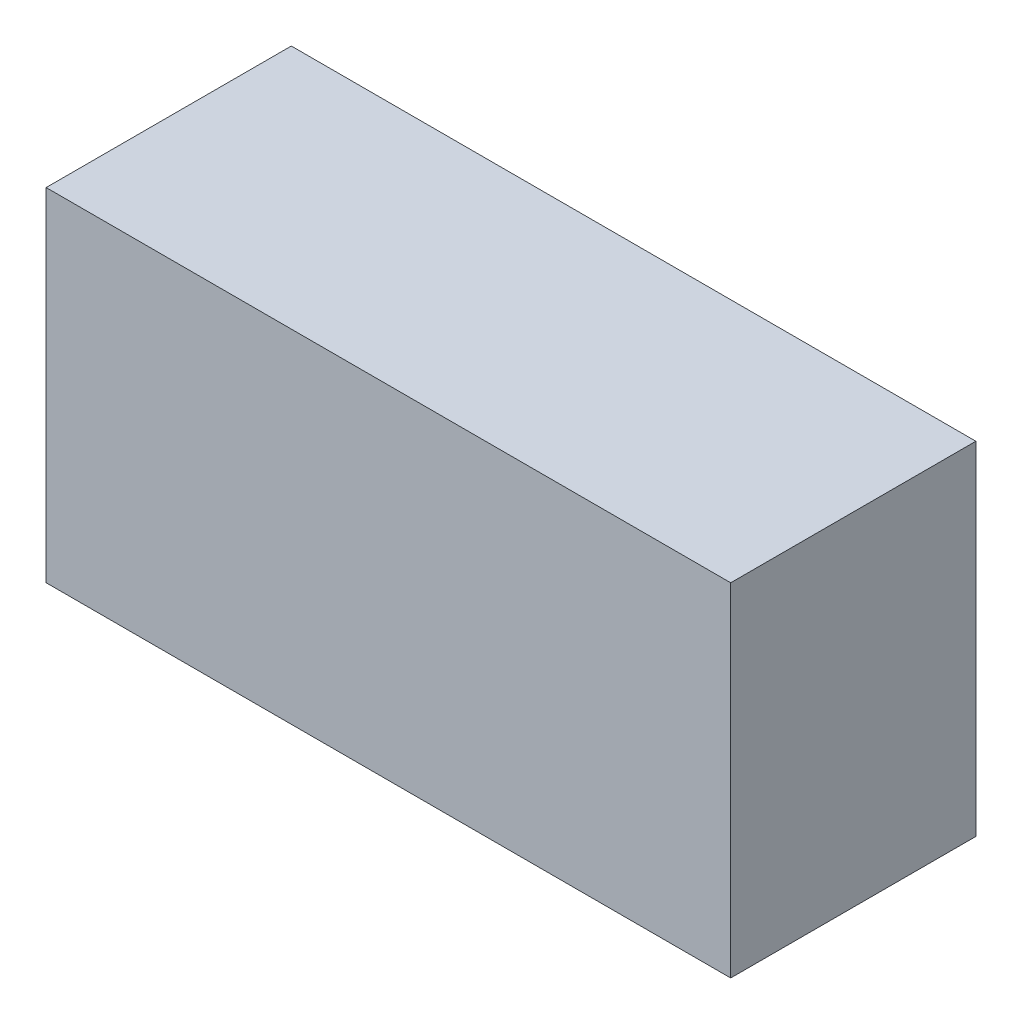
ISO-10303-21;
HEADER;
FILE_DESCRIPTION(('STEP AP214'),'2;1');
FILE_NAME('part.step','',(''),(''),'','','');
FILE_SCHEMA(('AUTOMOTIVE_DESIGN { 1 0 10303 214 1 1 1 1 }'));
ENDSEC;
DATA;
#1=APPLICATION_CONTEXT('core data for automotive mechanical design processes');
#2=APPLICATION_PROTOCOL_DEFINITION('international standard','automotive_design',2000,#1);
#3=PRODUCT_CONTEXT('',#1,'mechanical');
#4=PRODUCT('Part','Part','',(#3));
#5=PRODUCT_RELATED_PRODUCT_CATEGORY('part','',(#4));
#6=PRODUCT_DEFINITION_FORMATION('','',#4);
#7=PRODUCT_DEFINITION_CONTEXT('part definition',#1,'design');
#8=PRODUCT_DEFINITION('design','',#6,#7);
#9=PRODUCT_DEFINITION_SHAPE('','',#8);
#10=(LENGTH_UNIT() NAMED_UNIT(*) SI_UNIT(.MILLI.,.METRE.));
#11=(NAMED_UNIT(*) PLANE_ANGLE_UNIT() SI_UNIT($,.RADIAN.));
#12=(NAMED_UNIT(*) SI_UNIT($,.STERADIAN.) SOLID_ANGLE_UNIT());
#13=UNCERTAINTY_MEASURE_WITH_UNIT(LENGTH_MEASURE(1.E-05),#10,'distance_accuracy_value','');
#14=(GEOMETRIC_REPRESENTATION_CONTEXT(3) GLOBAL_UNCERTAINTY_ASSIGNED_CONTEXT((#13)) GLOBAL_UNIT_ASSIGNED_CONTEXT((#10,
#11,#12)) REPRESENTATION_CONTEXT('',''));
#15=CARTESIAN_POINT('',(0.,0.,0.));
#16=DIRECTION('',(0.,0.,1.));
#17=DIRECTION('',(1.,0.,0.));
#18=AXIS2_PLACEMENT_3D('',#15,#16,#17);
#19=CARTESIAN_POINT('',(0.,0.,1.146));
#20=DIRECTION('',(0.,0.,1.));
#21=DIRECTION('',(1.,0.,0.));
#22=AXIS2_PLACEMENT_3D('',#19,#20,#21);
#23=PLANE('',#22);
#24=DIRECTION('',(-1.,0.,0.));
#25=VECTOR('',#24,1.);
#26=CARTESIAN_POINT('',(1.6,0.8,1.146));
#27=LINE('',#26,#25);
#28=CARTESIAN_POINT('',(-1.6,0.800000000000001,1.146));
#29=VERTEX_POINT('',#28);
#30=CARTESIAN_POINT('',(1.6,0.8,1.146));
#31=VERTEX_POINT('',#30);
#32=EDGE_CURVE('E58',#29,#31,#27,.F.);
#33=ORIENTED_EDGE('',*,*,#32,.F.);
#34=DIRECTION('',(0.,-1.,0.));
#35=VECTOR('',#34,1.);
#36=CARTESIAN_POINT('',(-1.6,0.800000000000001,1.146));
#37=LINE('',#36,#35);
#38=CARTESIAN_POINT('',(-1.6,-0.799999999999999,1.146));
#39=VERTEX_POINT('',#38);
#40=EDGE_CURVE('E53',#39,#29,#37,.F.);
#41=ORIENTED_EDGE('',*,*,#40,.F.);
#42=DIRECTION('',(1.,0.,0.));
#43=VECTOR('',#42,1.);
#44=CARTESIAN_POINT('',(-1.6,-0.8,1.146));
#45=LINE('',#44,#43);
#46=CARTESIAN_POINT('',(1.6,-0.8,1.146));
#47=VERTEX_POINT('',#46);
#48=EDGE_CURVE('E68',#47,#39,#45,.F.);
#49=ORIENTED_EDGE('',*,*,#48,.F.);
#50=DIRECTION('',(0.,1.,0.));
#51=VECTOR('',#50,1.);
#52=CARTESIAN_POINT('',(1.6,-0.800000000000001,1.146));
#53=LINE('',#52,#51);
#54=EDGE_CURVE('E20',#31,#47,#53,.F.);
#55=ORIENTED_EDGE('',*,*,#54,.F.);
#56=EDGE_LOOP('',(#33,#41,#49,#55));
#57=FACE_BOUND('',#56,.T.);
#58=ADVANCED_FACE('F17',(#57),#23,.T.);
#59=CARTESIAN_POINT('',(1.6,-0.800000000000001,0.));
#60=DIRECTION('',(1.,0.,0.));
#61=DIRECTION('',(0.,1.,0.));
#62=AXIS2_PLACEMENT_3D('',#59,#60,#61);
#63=PLANE('',#62);
#64=ORIENTED_EDGE('',*,*,#54,.T.);
#65=DIRECTION('',(0.,0.,1.));
#66=VECTOR('',#65,1.);
#67=CARTESIAN_POINT('',(1.6,-0.800000000000001,0.));
#68=LINE('',#67,#66);
#69=CARTESIAN_POINT('',(1.6,-0.8,0.));
#70=VERTEX_POINT('',#69);
#71=EDGE_CURVE('E79',#70,#47,#68,.T.);
#72=ORIENTED_EDGE('',*,*,#71,.F.);
#73=DIRECTION('',(0.,1.,0.));
#74=VECTOR('',#73,1.);
#75=CARTESIAN_POINT('',(1.6,0.,0.));
#76=LINE('',#75,#74);
#77=CARTESIAN_POINT('',(1.6,0.8,0.));
#78=VERTEX_POINT('',#77);
#79=EDGE_CURVE('E74',#70,#78,#76,.T.);
#80=ORIENTED_EDGE('',*,*,#79,.T.);
#81=DIRECTION('',(0.,0.,1.));
#82=VECTOR('',#81,1.);
#83=CARTESIAN_POINT('',(1.6,0.8,0.));
#84=LINE('',#83,#82);
#85=EDGE_CURVE('E63',#31,#78,#84,.F.);
#86=ORIENTED_EDGE('',*,*,#85,.F.);
#87=EDGE_LOOP('',(#64,#72,#80,#86));
#88=FACE_BOUND('',#87,.T.);
#89=ADVANCED_FACE('F73',(#88),#63,.T.);
#90=CARTESIAN_POINT('',(1.6,0.8,0.));
#91=DIRECTION('',(0.,1.,0.));
#92=DIRECTION('',(-1.,0.,0.));
#93=AXIS2_PLACEMENT_3D('',#90,#91,#92);
#94=PLANE('',#93);
#95=ORIENTED_EDGE('',*,*,#32,.T.);
#96=ORIENTED_EDGE('',*,*,#85,.T.);
#97=DIRECTION('',(1.,0.,0.));
#98=VECTOR('',#97,1.);
#99=CARTESIAN_POINT('',(0.,0.8,0.));
#100=LINE('',#99,#98);
#101=CARTESIAN_POINT('',(-1.6,0.800000000000001,0.));
#102=VERTEX_POINT('',#101);
#103=EDGE_CURVE('E84',#78,#102,#100,.F.);
#104=ORIENTED_EDGE('',*,*,#103,.T.);
#105=DIRECTION('',(0.,0.,1.));
#106=VECTOR('',#105,1.);
#107=CARTESIAN_POINT('',(-1.6,0.800000000000001,0.));
#108=LINE('',#107,#106);
#109=EDGE_CURVE('E65',#29,#102,#108,.F.);
#110=ORIENTED_EDGE('',*,*,#109,.F.);
#111=EDGE_LOOP('',(#95,#96,#104,#110));
#112=FACE_BOUND('',#111,.T.);
#113=ADVANCED_FACE('F60',(#112),#94,.T.);
#114=CARTESIAN_POINT('',(-1.6,0.800000000000001,0.));
#115=DIRECTION('',(-1.,0.,0.));
#116=DIRECTION('',(0.,-1.,0.));
#117=AXIS2_PLACEMENT_3D('',#114,#115,#116);
#118=PLANE('',#117);
#119=ORIENTED_EDGE('',*,*,#40,.T.);
#120=ORIENTED_EDGE('',*,*,#109,.T.);
#121=DIRECTION('',(0.,1.,0.));
#122=VECTOR('',#121,1.);
#123=CARTESIAN_POINT('',(-1.6,0.,0.));
#124=LINE('',#123,#122);
#125=CARTESIAN_POINT('',(-1.6,-0.8,0.));
#126=VERTEX_POINT('',#125);
#127=EDGE_CURVE('E26',#102,#126,#124,.F.);
#128=ORIENTED_EDGE('',*,*,#127,.T.);
#129=DIRECTION('',(0.,0.,1.));
#130=VECTOR('',#129,1.);
#131=CARTESIAN_POINT('',(-1.6,-0.8,0.));
#132=LINE('',#131,#130);
#133=EDGE_CURVE('E34',#39,#126,#132,.F.);
#134=ORIENTED_EDGE('',*,*,#133,.F.);
#135=EDGE_LOOP('',(#119,#120,#128,#134));
#136=FACE_BOUND('',#135,.T.);
#137=ADVANCED_FACE('F88',(#136),#118,.T.);
#138=CARTESIAN_POINT('',(-1.6,-0.8,0.));
#139=DIRECTION('',(0.,-1.,0.));
#140=DIRECTION('',(1.,0.,0.));
#141=AXIS2_PLACEMENT_3D('',#138,#139,#140);
#142=PLANE('',#141);
#143=ORIENTED_EDGE('',*,*,#48,.T.);
#144=ORIENTED_EDGE('',*,*,#133,.T.);
#145=DIRECTION('',(1.,0.,0.));
#146=VECTOR('',#145,1.);
#147=CARTESIAN_POINT('',(0.,-0.8,0.));
#148=LINE('',#147,#146);
#149=EDGE_CURVE('E11',#126,#70,#148,.T.);
#150=ORIENTED_EDGE('',*,*,#149,.T.);
#151=ORIENTED_EDGE('',*,*,#71,.T.);
#152=EDGE_LOOP('',(#143,#144,#150,#151));
#153=FACE_BOUND('',#152,.T.);
#154=ADVANCED_FACE('F91',(#153),#142,.T.);
#155=CARTESIAN_POINT('',(0.,0.,0.));
#156=DIRECTION('',(0.,0.,1.));
#157=DIRECTION('',(1.,0.,0.));
#158=AXIS2_PLACEMENT_3D('',#155,#156,#157);
#159=PLANE('',#158);
#160=ORIENTED_EDGE('',*,*,#127,.F.);
#161=ORIENTED_EDGE('',*,*,#103,.F.);
#162=ORIENTED_EDGE('',*,*,#79,.F.);
#163=ORIENTED_EDGE('',*,*,#149,.F.);
#164=EDGE_LOOP('',(#160,#161,#162,#163));
#165=FACE_BOUND('',#164,.T.);
#166=ADVANCED_FACE('F90',(#165),#159,.F.);
#167=CLOSED_SHELL('',(#58,#89,#113,#137,#154,#166));
#168=MANIFOLD_SOLID_BREP('B1',#167);
#169=ADVANCED_BREP_SHAPE_REPRESENTATION('',(#18,#168),#14);
#170=SHAPE_DEFINITION_REPRESENTATION(#9,#169);
ENDSEC;
END-ISO-10303-21;
